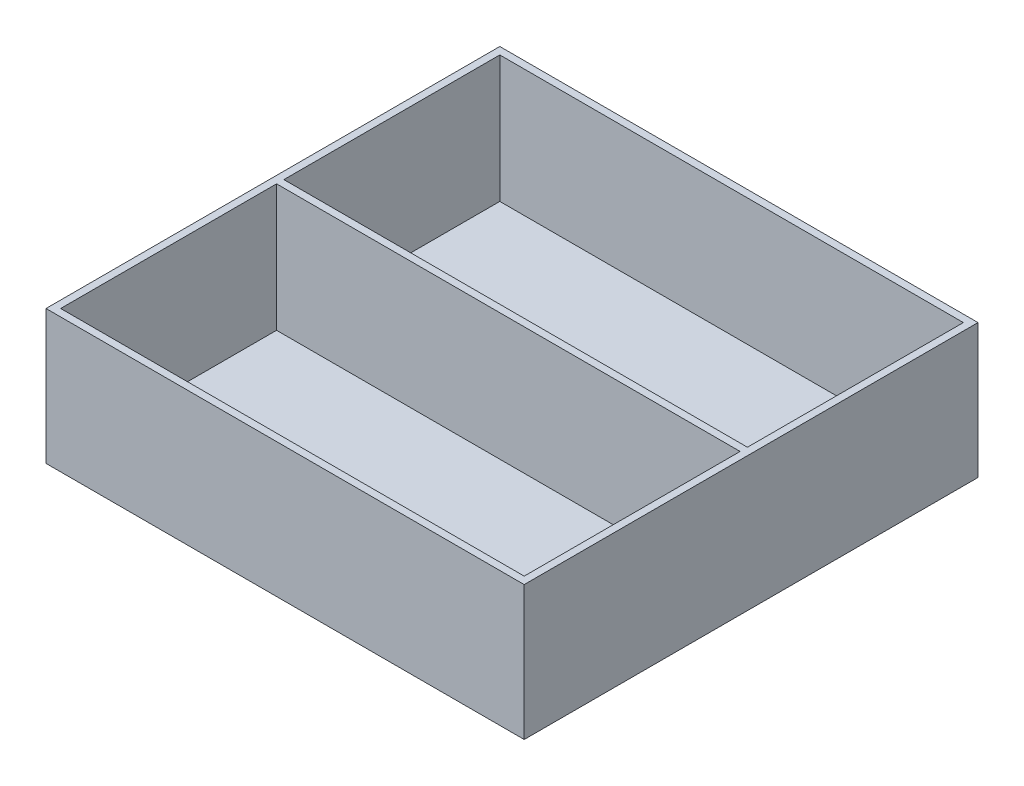
ISO-10303-21;
HEADER;
FILE_DESCRIPTION(('STEP AP214'),'2;1');
FILE_NAME('part.step','',(''),(''),'','','');
FILE_SCHEMA(('AUTOMOTIVE_DESIGN { 1 0 10303 214 1 1 1 1 }'));
ENDSEC;
DATA;
#1=APPLICATION_CONTEXT('core data for automotive mechanical design processes');
#2=APPLICATION_PROTOCOL_DEFINITION('international standard','automotive_design',2000,#1);
#3=PRODUCT_CONTEXT('',#1,'mechanical');
#4=PRODUCT('Part','Part','',(#3));
#5=PRODUCT_RELATED_PRODUCT_CATEGORY('part','',(#4));
#6=PRODUCT_DEFINITION_FORMATION('','',#4);
#7=PRODUCT_DEFINITION_CONTEXT('part definition',#1,'design');
#8=PRODUCT_DEFINITION('design','',#6,#7);
#9=PRODUCT_DEFINITION_SHAPE('','',#8);
#10=(LENGTH_UNIT() NAMED_UNIT(*) SI_UNIT(.MILLI.,.METRE.));
#11=(NAMED_UNIT(*) PLANE_ANGLE_UNIT() SI_UNIT($,.RADIAN.));
#12=(NAMED_UNIT(*) SI_UNIT($,.STERADIAN.) SOLID_ANGLE_UNIT());
#13=UNCERTAINTY_MEASURE_WITH_UNIT(LENGTH_MEASURE(1.E-05),#10,'distance_accuracy_value','');
#14=(GEOMETRIC_REPRESENTATION_CONTEXT(3) GLOBAL_UNCERTAINTY_ASSIGNED_CONTEXT((#13)) GLOBAL_UNIT_ASSIGNED_CONTEXT((#10,
#11,#12)) REPRESENTATION_CONTEXT('',''));
#15=CARTESIAN_POINT('',(0.,0.,0.));
#16=DIRECTION('',(0.,0.,1.));
#17=DIRECTION('',(1.,0.,0.));
#18=AXIS2_PLACEMENT_3D('',#15,#16,#17);
#19=CARTESIAN_POINT('',(98.,55.,93.));
#20=DIRECTION('',(-1.,0.,0.));
#21=DIRECTION('',(0.,0.,1.));
#22=AXIS2_PLACEMENT_3D('',#19,#20,#21);
#23=PLANE('',#22);
#24=DIRECTION('',(0.,0.,-1.));
#25=VECTOR('',#24,1.);
#26=CARTESIAN_POINT('',(98.,0.,93.));
#27=LINE('',#26,#25);
#28=CARTESIAN_POINT('',(98.,0.,93.));
#29=VERTEX_POINT('',#28);
#30=CARTESIAN_POINT('',(98.,0.,-93.));
#31=VERTEX_POINT('',#30);
#32=EDGE_CURVE('E183',#29,#31,#27,.T.);
#33=ORIENTED_EDGE('',*,*,#32,.T.);
#34=DIRECTION('',(0.,-1.,0.));
#35=VECTOR('',#34,1.);
#36=CARTESIAN_POINT('',(98.,55.,-93.));
#37=LINE('',#36,#35);
#38=CARTESIAN_POINT('',(98.,55.,-93.));
#39=VERTEX_POINT('',#38);
#40=EDGE_CURVE('E11',#39,#31,#37,.T.);
#41=ORIENTED_EDGE('',*,*,#40,.F.);
#42=DIRECTION('',(0.,0.,-1.));
#43=VECTOR('',#42,1.);
#44=CARTESIAN_POINT('',(98.,55.,93.));
#45=LINE('',#44,#43);
#46=CARTESIAN_POINT('',(98.,55.,93.));
#47=VERTEX_POINT('',#46);
#48=EDGE_CURVE('E189',#47,#39,#45,.T.);
#49=ORIENTED_EDGE('',*,*,#48,.F.);
#50=DIRECTION('',(0.,-1.,0.));
#51=VECTOR('',#50,1.);
#52=CARTESIAN_POINT('',(98.,55.,93.));
#53=LINE('',#52,#51);
#54=EDGE_CURVE('E199',#47,#29,#53,.T.);
#55=ORIENTED_EDGE('',*,*,#54,.T.);
#56=EDGE_LOOP('',(#33,#41,#49,#55));
#57=FACE_BOUND('',#56,.T.);
#58=ADVANCED_FACE('F32',(#57),#23,.F.);
#59=CARTESIAN_POINT('',(-98.,55.,-93.));
#60=DIRECTION('',(0.,0.,1.));
#61=DIRECTION('',(1.,0.,0.));
#62=AXIS2_PLACEMENT_3D('',#59,#60,#61);
#63=PLANE('',#62);
#64=DIRECTION('',(-1.,0.,0.));
#65=VECTOR('',#64,1.);
#66=CARTESIAN_POINT('',(-98.,0.,-93.));
#67=LINE('',#66,#65);
#68=CARTESIAN_POINT('',(-98.,0.,-93.));
#69=VERTEX_POINT('',#68);
#70=EDGE_CURVE('E202',#31,#69,#67,.T.);
#71=ORIENTED_EDGE('',*,*,#70,.T.);
#72=DIRECTION('',(0.,-1.,0.));
#73=VECTOR('',#72,1.);
#74=CARTESIAN_POINT('',(-98.,55.,-93.));
#75=LINE('',#74,#73);
#76=CARTESIAN_POINT('',(-98.,55.,-93.));
#77=VERTEX_POINT('',#76);
#78=EDGE_CURVE('E39',#77,#69,#75,.T.);
#79=ORIENTED_EDGE('',*,*,#78,.F.);
#80=DIRECTION('',(-1.,0.,0.));
#81=VECTOR('',#80,1.);
#82=CARTESIAN_POINT('',(-98.,55.,-93.));
#83=LINE('',#82,#81);
#84=EDGE_CURVE('E192',#39,#77,#83,.T.);
#85=ORIENTED_EDGE('',*,*,#84,.F.);
#86=ORIENTED_EDGE('',*,*,#40,.T.);
#87=EDGE_LOOP('',(#71,#79,#85,#86));
#88=FACE_BOUND('',#87,.T.);
#89=ADVANCED_FACE('F232',(#88),#63,.F.);
#90=CARTESIAN_POINT('',(-98.,55.,93.));
#91=DIRECTION('',(1.,0.,0.));
#92=DIRECTION('',(0.,0.,-1.));
#93=AXIS2_PLACEMENT_3D('',#90,#91,#92);
#94=PLANE('',#93);
#95=DIRECTION('',(0.,0.,1.));
#96=VECTOR('',#95,1.);
#97=CARTESIAN_POINT('',(-98.,0.,93.));
#98=LINE('',#97,#96);
#99=CARTESIAN_POINT('',(-98.,0.,93.));
#100=VERTEX_POINT('',#99);
#101=EDGE_CURVE('E204',#69,#100,#98,.T.);
#102=ORIENTED_EDGE('',*,*,#101,.T.);
#103=DIRECTION('',(0.,-1.,0.));
#104=VECTOR('',#103,1.);
#105=CARTESIAN_POINT('',(-98.,55.,93.));
#106=LINE('',#105,#104);
#107=CARTESIAN_POINT('',(-98.,55.,93.));
#108=VERTEX_POINT('',#107);
#109=EDGE_CURVE('E209',#108,#100,#106,.T.);
#110=ORIENTED_EDGE('',*,*,#109,.F.);
#111=DIRECTION('',(0.,0.,1.));
#112=VECTOR('',#111,1.);
#113=CARTESIAN_POINT('',(-98.,55.,93.));
#114=LINE('',#113,#112);
#115=EDGE_CURVE('E195',#77,#108,#114,.T.);
#116=ORIENTED_EDGE('',*,*,#115,.F.);
#117=ORIENTED_EDGE('',*,*,#78,.T.);
#118=EDGE_LOOP('',(#102,#110,#116,#117));
#119=FACE_BOUND('',#118,.T.);
#120=ADVANCED_FACE('F216',(#119),#94,.F.);
#121=CARTESIAN_POINT('',(-98.,55.,93.));
#122=DIRECTION('',(0.,0.,-1.));
#123=DIRECTION('',(-1.,0.,0.));
#124=AXIS2_PLACEMENT_3D('',#121,#122,#123);
#125=PLANE('',#124);
#126=DIRECTION('',(1.,0.,0.));
#127=VECTOR('',#126,1.);
#128=CARTESIAN_POINT('',(-98.,0.,93.));
#129=LINE('',#128,#127);
#130=EDGE_CURVE('E193',#100,#29,#129,.T.);
#131=ORIENTED_EDGE('',*,*,#130,.T.);
#132=ORIENTED_EDGE('',*,*,#54,.F.);
#133=DIRECTION('',(1.,0.,0.));
#134=VECTOR('',#133,1.);
#135=CARTESIAN_POINT('',(-98.,55.,93.));
#136=LINE('',#135,#134);
#137=EDGE_CURVE('E197',#108,#47,#136,.T.);
#138=ORIENTED_EDGE('',*,*,#137,.F.);
#139=ORIENTED_EDGE('',*,*,#109,.T.);
#140=EDGE_LOOP('',(#131,#132,#138,#139));
#141=FACE_BOUND('',#140,.T.);
#142=ADVANCED_FACE('F225',(#141),#125,.F.);
#143=CARTESIAN_POINT('',(0.,55.,0.));
#144=DIRECTION('',(0.,-1.,0.));
#145=DIRECTION('',(0.,0.,-1.));
#146=AXIS2_PLACEMENT_3D('',#143,#144,#145);
#147=PLANE('',#146);
#148=DIRECTION('',(-1.,0.,0.));
#149=VECTOR('',#148,1.);
#150=CARTESIAN_POINT('',(-95.,55.,-90.));
#151=LINE('',#150,#149);
#152=CARTESIAN_POINT('',(95.,55.,-90.));
#153=VERTEX_POINT('',#152);
#154=CARTESIAN_POINT('',(-95.,55.,-90.));
#155=VERTEX_POINT('',#154);
#156=EDGE_CURVE('E149',#153,#155,#151,.T.);
#157=ORIENTED_EDGE('',*,*,#156,.F.);
#158=DIRECTION('',(0.,0.,-1.));
#159=VECTOR('',#158,1.);
#160=CARTESIAN_POINT('',(95.,55.,-1.49999999999998));
#161=LINE('',#160,#159);
#162=CARTESIAN_POINT('',(95.,55.,-1.49999999999998));
#163=VERTEX_POINT('',#162);
#164=EDGE_CURVE('E46',#163,#153,#161,.T.);
#165=ORIENTED_EDGE('',*,*,#164,.F.);
#166=DIRECTION('',(1.,0.,0.));
#167=VECTOR('',#166,1.);
#168=CARTESIAN_POINT('',(-95.,55.,-1.49999999999998));
#169=LINE('',#168,#167);
#170=CARTESIAN_POINT('',(-95.,55.,-1.49999999999998));
#171=VERTEX_POINT('',#170);
#172=EDGE_CURVE('E140',#171,#163,#169,.T.);
#173=ORIENTED_EDGE('',*,*,#172,.F.);
#174=DIRECTION('',(0.,0.,1.));
#175=VECTOR('',#174,1.);
#176=CARTESIAN_POINT('',(-95.,55.,-1.49999999999998));
#177=LINE('',#176,#175);
#178=EDGE_CURVE('E143',#155,#171,#177,.T.);
#179=ORIENTED_EDGE('',*,*,#178,.F.);
#180=EDGE_LOOP('',(#157,#165,#173,#179));
#181=FACE_BOUND('',#180,.T.);
#182=DIRECTION('',(-1.,0.,0.));
#183=VECTOR('',#182,1.);
#184=CARTESIAN_POINT('',(-95.,55.,1.50000000000002));
#185=LINE('',#184,#183);
#186=CARTESIAN_POINT('',(95.,55.,1.50000000000002));
#187=VERTEX_POINT('',#186);
#188=CARTESIAN_POINT('',(-95.,55.,1.50000000000002));
#189=VERTEX_POINT('',#188);
#190=EDGE_CURVE('E173',#187,#189,#185,.T.);
#191=ORIENTED_EDGE('',*,*,#190,.F.);
#192=DIRECTION('',(0.,0.,-1.));
#193=VECTOR('',#192,1.);
#194=CARTESIAN_POINT('',(95.,55.,90.));
#195=LINE('',#194,#193);
#196=CARTESIAN_POINT('',(95.,55.,90.));
#197=VERTEX_POINT('',#196);
#198=EDGE_CURVE('E54',#197,#187,#195,.T.);
#199=ORIENTED_EDGE('',*,*,#198,.F.);
#200=DIRECTION('',(1.,0.,0.));
#201=VECTOR('',#200,1.);
#202=CARTESIAN_POINT('',(-95.,55.,90.));
#203=LINE('',#202,#201);
#204=CARTESIAN_POINT('',(-95.,55.,90.));
#205=VERTEX_POINT('',#204);
#206=EDGE_CURVE('E162',#205,#197,#203,.T.);
#207=ORIENTED_EDGE('',*,*,#206,.F.);
#208=DIRECTION('',(0.,0.,1.));
#209=VECTOR('',#208,1.);
#210=CARTESIAN_POINT('',(-95.,55.,90.));
#211=LINE('',#210,#209);
#212=EDGE_CURVE('E176',#189,#205,#211,.T.);
#213=ORIENTED_EDGE('',*,*,#212,.F.);
#214=EDGE_LOOP('',(#191,#199,#207,#213));
#215=FACE_BOUND('',#214,.T.);
#216=ORIENTED_EDGE('',*,*,#48,.T.);
#217=ORIENTED_EDGE('',*,*,#84,.T.);
#218=ORIENTED_EDGE('',*,*,#115,.T.);
#219=ORIENTED_EDGE('',*,*,#137,.T.);
#220=EDGE_LOOP('',(#216,#217,#218,#219));
#221=FACE_BOUND('',#220,.T.);
#222=ADVANCED_FACE('F231',(#181,#215,#221),#147,.F.);
#223=CARTESIAN_POINT('',(0.,0.,0.));
#224=DIRECTION('',(0.,-1.,0.));
#225=DIRECTION('',(0.,0.,-1.));
#226=AXIS2_PLACEMENT_3D('',#223,#224,#225);
#227=PLANE('',#226);
#228=ORIENTED_EDGE('',*,*,#32,.F.);
#229=ORIENTED_EDGE('',*,*,#130,.F.);
#230=ORIENTED_EDGE('',*,*,#101,.F.);
#231=ORIENTED_EDGE('',*,*,#70,.F.);
#232=EDGE_LOOP('',(#228,#229,#230,#231));
#233=FACE_BOUND('',#232,.T.);
#234=ADVANCED_FACE('F222',(#233),#227,.T.);
#235=CARTESIAN_POINT('',(95.,3.,90.));
#236=DIRECTION('',(1.,0.,0.));
#237=DIRECTION('',(0.,0.,-1.));
#238=AXIS2_PLACEMENT_3D('',#235,#236,#237);
#239=PLANE('',#238);
#240=ORIENTED_EDGE('',*,*,#198,.T.);
#241=DIRECTION('',(0.,1.,0.));
#242=VECTOR('',#241,1.);
#243=CARTESIAN_POINT('',(95.,3.,1.50000000000002));
#244=LINE('',#243,#242);
#245=CARTESIAN_POINT('',(95.,3.,1.50000000000002));
#246=VERTEX_POINT('',#245);
#247=EDGE_CURVE('E171',#246,#187,#244,.T.);
#248=ORIENTED_EDGE('',*,*,#247,.F.);
#249=DIRECTION('',(0.,0.,-1.));
#250=VECTOR('',#249,1.);
#251=CARTESIAN_POINT('',(95.,3.,90.));
#252=LINE('',#251,#250);
#253=CARTESIAN_POINT('',(95.,3.,90.));
#254=VERTEX_POINT('',#253);
#255=EDGE_CURVE('E158',#254,#246,#252,.T.);
#256=ORIENTED_EDGE('',*,*,#255,.F.);
#257=DIRECTION('',(0.,1.,0.));
#258=VECTOR('',#257,1.);
#259=CARTESIAN_POINT('',(95.,3.,90.));
#260=LINE('',#259,#258);
#261=EDGE_CURVE('E181',#254,#197,#260,.T.);
#262=ORIENTED_EDGE('',*,*,#261,.T.);
#263=EDGE_LOOP('',(#240,#248,#256,#262));
#264=FACE_BOUND('',#263,.T.);
#265=ADVANCED_FACE('F244',(#264),#239,.F.);
#266=CARTESIAN_POINT('',(-95.,3.,90.));
#267=DIRECTION('',(0.,0.,1.));
#268=DIRECTION('',(1.,0.,0.));
#269=AXIS2_PLACEMENT_3D('',#266,#267,#268);
#270=PLANE('',#269);
#271=ORIENTED_EDGE('',*,*,#206,.T.);
#272=ORIENTED_EDGE('',*,*,#261,.F.);
#273=DIRECTION('',(1.,0.,0.));
#274=VECTOR('',#273,1.);
#275=CARTESIAN_POINT('',(-95.,3.,90.));
#276=LINE('',#275,#274);
#277=CARTESIAN_POINT('',(-95.,3.,90.));
#278=VERTEX_POINT('',#277);
#279=EDGE_CURVE('E168',#278,#254,#276,.T.);
#280=ORIENTED_EDGE('',*,*,#279,.F.);
#281=DIRECTION('',(0.,1.,0.));
#282=VECTOR('',#281,1.);
#283=CARTESIAN_POINT('',(-95.,3.,90.));
#284=LINE('',#283,#282);
#285=EDGE_CURVE('E184',#278,#205,#284,.T.);
#286=ORIENTED_EDGE('',*,*,#285,.T.);
#287=EDGE_LOOP('',(#271,#272,#280,#286));
#288=FACE_BOUND('',#287,.T.);
#289=ADVANCED_FACE('F250',(#288),#270,.F.);
#290=CARTESIAN_POINT('',(-95.,3.,90.));
#291=DIRECTION('',(-1.,0.,0.));
#292=DIRECTION('',(0.,0.,1.));
#293=AXIS2_PLACEMENT_3D('',#290,#291,#292);
#294=PLANE('',#293);
#295=ORIENTED_EDGE('',*,*,#212,.T.);
#296=ORIENTED_EDGE('',*,*,#285,.F.);
#297=DIRECTION('',(0.,0.,1.));
#298=VECTOR('',#297,1.);
#299=CARTESIAN_POINT('',(-95.,3.,90.));
#300=LINE('',#299,#298);
#301=CARTESIAN_POINT('',(-95.,3.,1.50000000000002));
#302=VERTEX_POINT('',#301);
#303=EDGE_CURVE('E165',#302,#278,#300,.T.);
#304=ORIENTED_EDGE('',*,*,#303,.F.);
#305=DIRECTION('',(0.,1.,0.));
#306=VECTOR('',#305,1.);
#307=CARTESIAN_POINT('',(-95.,3.,1.50000000000002));
#308=LINE('',#307,#306);
#309=EDGE_CURVE('E186',#302,#189,#308,.T.);
#310=ORIENTED_EDGE('',*,*,#309,.T.);
#311=EDGE_LOOP('',(#295,#296,#304,#310));
#312=FACE_BOUND('',#311,.T.);
#313=ADVANCED_FACE('F255',(#312),#294,.F.);
#314=CARTESIAN_POINT('',(-95.,3.,1.50000000000002));
#315=DIRECTION('',(0.,0.,-1.));
#316=DIRECTION('',(-1.,0.,0.));
#317=AXIS2_PLACEMENT_3D('',#314,#315,#316);
#318=PLANE('',#317);
#319=ORIENTED_EDGE('',*,*,#190,.T.);
#320=ORIENTED_EDGE('',*,*,#309,.F.);
#321=DIRECTION('',(-1.,0.,0.));
#322=VECTOR('',#321,1.);
#323=CARTESIAN_POINT('',(-95.,3.,1.50000000000002));
#324=LINE('',#323,#322);
#325=EDGE_CURVE('E161',#246,#302,#324,.T.);
#326=ORIENTED_EDGE('',*,*,#325,.F.);
#327=ORIENTED_EDGE('',*,*,#247,.T.);
#328=EDGE_LOOP('',(#319,#320,#326,#327));
#329=FACE_BOUND('',#328,.T.);
#330=ADVANCED_FACE('F251',(#329),#318,.F.);
#331=CARTESIAN_POINT('',(0.,3.,0.));
#332=DIRECTION('',(0.,-1.,0.));
#333=DIRECTION('',(0.,0.,-1.));
#334=AXIS2_PLACEMENT_3D('',#331,#332,#333);
#335=PLANE('',#334);
#336=ORIENTED_EDGE('',*,*,#255,.T.);
#337=ORIENTED_EDGE('',*,*,#325,.T.);
#338=ORIENTED_EDGE('',*,*,#303,.T.);
#339=ORIENTED_EDGE('',*,*,#279,.T.);
#340=EDGE_LOOP('',(#336,#337,#338,#339));
#341=FACE_BOUND('',#340,.T.);
#342=ADVANCED_FACE('F254',(#341),#335,.F.);
#343=CARTESIAN_POINT('',(95.,3.,-1.49999999999998));
#344=DIRECTION('',(1.,0.,0.));
#345=DIRECTION('',(0.,0.,-1.));
#346=AXIS2_PLACEMENT_3D('',#343,#344,#345);
#347=PLANE('',#346);
#348=ORIENTED_EDGE('',*,*,#164,.T.);
#349=DIRECTION('',(0.,1.,0.));
#350=VECTOR('',#349,1.);
#351=CARTESIAN_POINT('',(95.,3.,-90.));
#352=LINE('',#351,#350);
#353=CARTESIAN_POINT('',(95.,3.,-90.));
#354=VERTEX_POINT('',#353);
#355=EDGE_CURVE('E118',#354,#153,#352,.T.);
#356=ORIENTED_EDGE('',*,*,#355,.F.);
#357=DIRECTION('',(0.,0.,-1.));
#358=VECTOR('',#357,1.);
#359=CARTESIAN_POINT('',(95.,3.,-1.49999999999998));
#360=LINE('',#359,#358);
#361=CARTESIAN_POINT('',(95.,3.,-1.49999999999998));
#362=VERTEX_POINT('',#361);
#363=EDGE_CURVE('E122',#362,#354,#360,.T.);
#364=ORIENTED_EDGE('',*,*,#363,.F.);
#365=DIRECTION('',(0.,1.,0.));
#366=VECTOR('',#365,1.);
#367=CARTESIAN_POINT('',(95.,3.,-1.49999999999998));
#368=LINE('',#367,#366);
#369=EDGE_CURVE('E153',#362,#163,#368,.T.);
#370=ORIENTED_EDGE('',*,*,#369,.T.);
#371=EDGE_LOOP('',(#348,#356,#364,#370));
#372=FACE_BOUND('',#371,.T.);
#373=ADVANCED_FACE('F120',(#372),#347,.F.);
#374=CARTESIAN_POINT('',(-95.,3.,-1.49999999999998));
#375=DIRECTION('',(0.,0.,1.));
#376=DIRECTION('',(1.,0.,0.));
#377=AXIS2_PLACEMENT_3D('',#374,#375,#376);
#378=PLANE('',#377);
#379=ORIENTED_EDGE('',*,*,#172,.T.);
#380=ORIENTED_EDGE('',*,*,#369,.F.);
#381=DIRECTION('',(1.,0.,0.));
#382=VECTOR('',#381,1.);
#383=CARTESIAN_POINT('',(-95.,3.,-1.49999999999998));
#384=LINE('',#383,#382);
#385=CARTESIAN_POINT('',(-95.,3.,-1.49999999999998));
#386=VERTEX_POINT('',#385);
#387=EDGE_CURVE('E128',#386,#362,#384,.T.);
#388=ORIENTED_EDGE('',*,*,#387,.F.);
#389=DIRECTION('',(0.,1.,0.));
#390=VECTOR('',#389,1.);
#391=CARTESIAN_POINT('',(-95.,3.,-1.49999999999998));
#392=LINE('',#391,#390);
#393=EDGE_CURVE('E155',#386,#171,#392,.T.);
#394=ORIENTED_EDGE('',*,*,#393,.T.);
#395=EDGE_LOOP('',(#379,#380,#388,#394));
#396=FACE_BOUND('',#395,.T.);
#397=ADVANCED_FACE('F268',(#396),#378,.F.);
#398=CARTESIAN_POINT('',(-95.,3.,-1.49999999999998));
#399=DIRECTION('',(-1.,0.,0.));
#400=DIRECTION('',(0.,0.,1.));
#401=AXIS2_PLACEMENT_3D('',#398,#399,#400);
#402=PLANE('',#401);
#403=ORIENTED_EDGE('',*,*,#178,.T.);
#404=ORIENTED_EDGE('',*,*,#393,.F.);
#405=DIRECTION('',(0.,0.,1.));
#406=VECTOR('',#405,1.);
#407=CARTESIAN_POINT('',(-95.,3.,-1.49999999999998));
#408=LINE('',#407,#406);
#409=CARTESIAN_POINT('',(-95.,3.,-90.));
#410=VERTEX_POINT('',#409);
#411=EDGE_CURVE('E136',#410,#386,#408,.T.);
#412=ORIENTED_EDGE('',*,*,#411,.F.);
#413=DIRECTION('',(0.,1.,0.));
#414=VECTOR('',#413,1.);
#415=CARTESIAN_POINT('',(-95.,3.,-90.));
#416=LINE('',#415,#414);
#417=EDGE_CURVE('E127',#410,#155,#416,.T.);
#418=ORIENTED_EDGE('',*,*,#417,.T.);
#419=EDGE_LOOP('',(#403,#404,#412,#418));
#420=FACE_BOUND('',#419,.T.);
#421=ADVANCED_FACE('F271',(#420),#402,.F.);
#422=CARTESIAN_POINT('',(-95.,3.,-90.));
#423=DIRECTION('',(0.,0.,-1.));
#424=DIRECTION('',(-1.,0.,0.));
#425=AXIS2_PLACEMENT_3D('',#422,#423,#424);
#426=PLANE('',#425);
#427=ORIENTED_EDGE('',*,*,#156,.T.);
#428=ORIENTED_EDGE('',*,*,#417,.F.);
#429=DIRECTION('',(-1.,0.,0.));
#430=VECTOR('',#429,1.);
#431=CARTESIAN_POINT('',(-95.,3.,-90.));
#432=LINE('',#431,#430);
#433=EDGE_CURVE('E131',#354,#410,#432,.T.);
#434=ORIENTED_EDGE('',*,*,#433,.F.);
#435=ORIENTED_EDGE('',*,*,#355,.T.);
#436=EDGE_LOOP('',(#427,#428,#434,#435));
#437=FACE_BOUND('',#436,.T.);
#438=ADVANCED_FACE('F132',(#437),#426,.F.);
#439=CARTESIAN_POINT('',(0.,3.,0.));
#440=DIRECTION('',(0.,-1.,0.));
#441=DIRECTION('',(0.,0.,-1.));
#442=AXIS2_PLACEMENT_3D('',#439,#440,#441);
#443=PLANE('',#442);
#444=ORIENTED_EDGE('',*,*,#363,.T.);
#445=ORIENTED_EDGE('',*,*,#433,.T.);
#446=ORIENTED_EDGE('',*,*,#411,.T.);
#447=ORIENTED_EDGE('',*,*,#387,.T.);
#448=EDGE_LOOP('',(#444,#445,#446,#447));
#449=FACE_BOUND('',#448,.T.);
#450=ADVANCED_FACE('F138',(#449),#443,.F.);
#451=CLOSED_SHELL('',(#58,#89,#120,#142,#222,#234,#265,#289,#313,#330,#342,#373,#397,#421,#438,#450));
#452=MANIFOLD_SOLID_BREP('B2',#451);
#453=ADVANCED_BREP_SHAPE_REPRESENTATION('',(#18,#452),#14);
#454=SHAPE_DEFINITION_REPRESENTATION(#9,#453);
ENDSEC;
END-ISO-10303-21;
